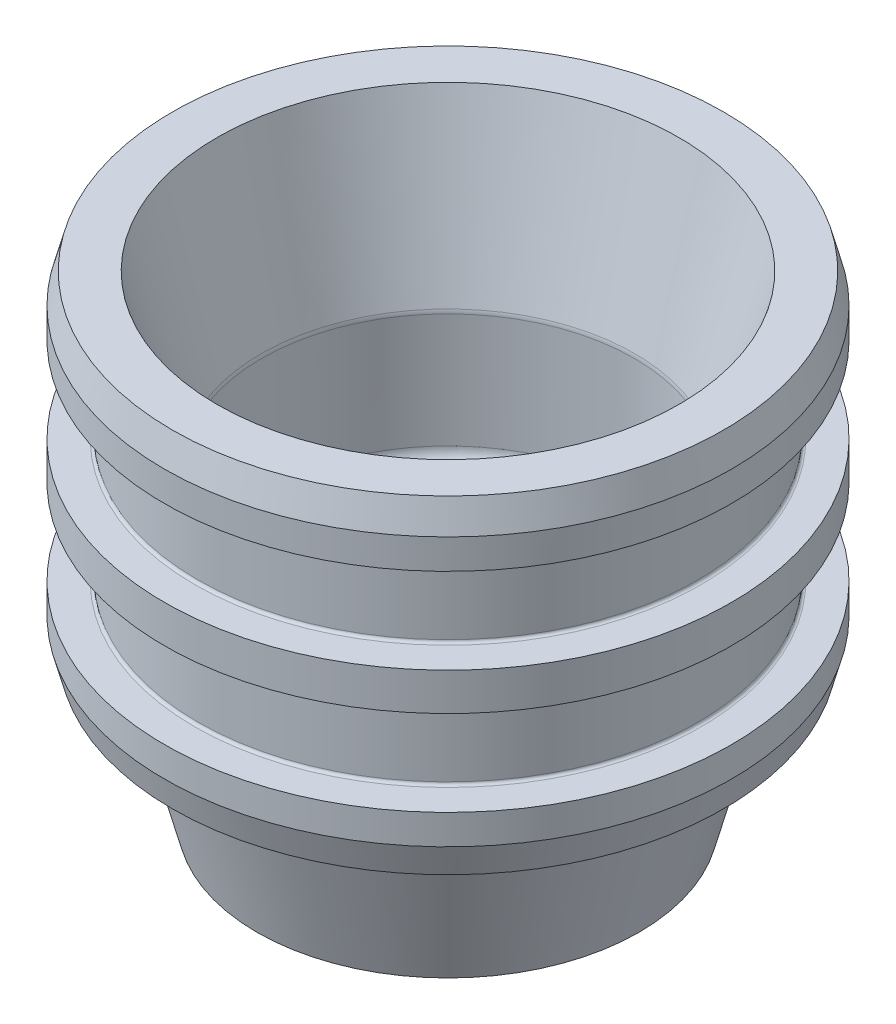
ISO-10303-21;
HEADER;
FILE_DESCRIPTION(('STEP AP214'),'2;1');
FILE_NAME('part.step','',(''),(''),'','','');
FILE_SCHEMA(('AUTOMOTIVE_DESIGN { 1 0 10303 214 1 1 1 1 }'));
ENDSEC;
DATA;
#1=APPLICATION_CONTEXT('core data for automotive mechanical design processes');
#2=APPLICATION_PROTOCOL_DEFINITION('international standard','automotive_design',2000,#1);
#3=PRODUCT_CONTEXT('',#1,'mechanical');
#4=PRODUCT('Part','Part','',(#3));
#5=PRODUCT_RELATED_PRODUCT_CATEGORY('part','',(#4));
#6=PRODUCT_DEFINITION_FORMATION('','',#4);
#7=PRODUCT_DEFINITION_CONTEXT('part definition',#1,'design');
#8=PRODUCT_DEFINITION('design','',#6,#7);
#9=PRODUCT_DEFINITION_SHAPE('','',#8);
#10=(LENGTH_UNIT() NAMED_UNIT(*) SI_UNIT(.MILLI.,.METRE.));
#11=(NAMED_UNIT(*) PLANE_ANGLE_UNIT() SI_UNIT($,.RADIAN.));
#12=(NAMED_UNIT(*) SI_UNIT($,.STERADIAN.) SOLID_ANGLE_UNIT());
#13=UNCERTAINTY_MEASURE_WITH_UNIT(LENGTH_MEASURE(1.E-05),#10,'distance_accuracy_value','');
#14=(GEOMETRIC_REPRESENTATION_CONTEXT(3) GLOBAL_UNCERTAINTY_ASSIGNED_CONTEXT((#13)) GLOBAL_UNIT_ASSIGNED_CONTEXT((#10,
#11,#12)) REPRESENTATION_CONTEXT('',''));
#15=CARTESIAN_POINT('',(0.,0.,0.));
#16=DIRECTION('',(0.,0.,1.));
#17=DIRECTION('',(1.,0.,0.));
#18=AXIS2_PLACEMENT_3D('',#15,#16,#17);
#19=CARTESIAN_POINT('',(0.,40.64,0.));
#20=DIRECTION('',(0.,-1.,0.));
#21=DIRECTION('',(0.,0.,-1.));
#22=AXIS2_PLACEMENT_3D('',#19,#20,#21);
#23=CYLINDRICAL_SURFACE('',#22,24.1554);
#24=CARTESIAN_POINT('',(0.,15.24,0.));
#25=DIRECTION('',(0.,-1.,0.));
#26=DIRECTION('',(0.,0.,-1.));
#27=AXIS2_PLACEMENT_3D('',#24,#25,#26);
#28=CIRCLE('',#27,24.1554);
#29=CARTESIAN_POINT('',(0.,15.24,-24.1554));
#30=VERTEX_POINT('',#29);
#31=EDGE_CURVE('E10',#30,#30,#28,.F.);
#32=ORIENTED_EDGE('',*,*,#31,.T.);
#33=EDGE_LOOP('',(#32));
#34=FACE_BOUND('',#33,.T.);
#35=CARTESIAN_POINT('',(0.,17.78,0.));
#36=DIRECTION('',(0.,-1.,0.));
#37=DIRECTION('',(0.,0.,-1.));
#38=AXIS2_PLACEMENT_3D('',#35,#36,#37);
#39=CIRCLE('',#38,24.1554);
#40=CARTESIAN_POINT('',(0.,17.78,-24.1554));
#41=VERTEX_POINT('',#40);
#42=EDGE_CURVE('E136',#41,#41,#39,.T.);
#43=ORIENTED_EDGE('',*,*,#42,.T.);
#44=EDGE_LOOP('',(#43));
#45=FACE_BOUND('',#44,.T.);
#46=ADVANCED_FACE('F39',(#34,#45),#23,.T.);
#47=CARTESIAN_POINT('',(0.,28.2702,0.));
#48=DIRECTION('',(0.,-1.,0.));
#49=DIRECTION('',(0.,0.,-1.));
#50=AXIS2_PLACEMENT_3D('',#47,#48,#49);
#51=CIRCLE('',#50,24.1554);
#52=CARTESIAN_POINT('',(0.,28.2702,-24.1554));
#53=VERTEX_POINT('',#52);
#54=EDGE_CURVE('E108',#53,#53,#51,.T.);
#55=ORIENTED_EDGE('',*,*,#54,.T.);
#56=EDGE_LOOP('',(#55));
#57=FACE_BOUND('',#56,.T.);
#58=CARTESIAN_POINT('',(0.,25.0698,0.));
#59=DIRECTION('',(0.,-1.,0.));
#60=DIRECTION('',(0.,0.,-1.));
#61=AXIS2_PLACEMENT_3D('',#58,#59,#60);
#62=CIRCLE('',#61,24.1554);
#63=CARTESIAN_POINT('',(0.,25.0698,-24.1554));
#64=VERTEX_POINT('',#63);
#65=EDGE_CURVE('E132',#64,#64,#62,.T.);
#66=ORIENTED_EDGE('',*,*,#65,.F.);
#67=EDGE_LOOP('',(#66));
#68=FACE_BOUND('',#67,.T.);
#69=ADVANCED_FACE('F174',(#57,#68),#23,.T.);
#70=CARTESIAN_POINT('',(0.,38.0999999999999,0.));
#71=DIRECTION('',(0.,1.,0.));
#72=DIRECTION('',(0.,0.,1.));
#73=AXIS2_PLACEMENT_3D('',#70,#71,#72);
#74=CIRCLE('',#73,24.1554);
#75=CARTESIAN_POINT('',(0.,38.0999999999999,24.1554));
#76=VERTEX_POINT('',#75);
#77=EDGE_CURVE('E84',#76,#76,#74,.F.);
#78=ORIENTED_EDGE('',*,*,#77,.T.);
#79=EDGE_LOOP('',(#78));
#80=FACE_BOUND('',#79,.T.);
#81=CARTESIAN_POINT('',(0.,35.56,0.));
#82=DIRECTION('',(0.,-1.,0.));
#83=DIRECTION('',(0.,0.,-1.));
#84=AXIS2_PLACEMENT_3D('',#81,#82,#83);
#85=CIRCLE('',#84,24.1554);
#86=CARTESIAN_POINT('',(0.,35.56,-24.1554));
#87=VERTEX_POINT('',#86);
#88=EDGE_CURVE('E112',#87,#87,#85,.T.);
#89=ORIENTED_EDGE('',*,*,#88,.F.);
#90=EDGE_LOOP('',(#89));
#91=FACE_BOUND('',#90,.T.);
#92=ADVANCED_FACE('F176',(#80,#91),#23,.T.);
#93=CARTESIAN_POINT('',(0.,40.64,0.));
#94=DIRECTION('',(0.,1.,0.));
#95=DIRECTION('',(0.,0.,1.));
#96=AXIS2_PLACEMENT_3D('',#93,#94,#95);
#97=PLANE('',#96);
#98=CARTESIAN_POINT('',(0.,40.64,0.));
#99=DIRECTION('',(0.,1.,0.));
#100=DIRECTION('',(0.,0.,1.));
#101=AXIS2_PLACEMENT_3D('',#98,#99,#100);
#102=CIRCLE('',#101,19.685);
#103=CARTESIAN_POINT('',(0.,40.64,19.685));
#104=VERTEX_POINT('',#103);
#105=EDGE_CURVE('E80',#104,#104,#102,.F.);
#106=ORIENTED_EDGE('',*,*,#105,.T.);
#107=EDGE_LOOP('',(#106));
#108=FACE_BOUND('',#107,.T.);
#109=CARTESIAN_POINT('',(0.,40.64,0.));
#110=DIRECTION('',(0.,1.,0.));
#111=DIRECTION('',(0.,0.,1.));
#112=AXIS2_PLACEMENT_3D('',#109,#110,#111);
#113=CIRCLE('',#112,23.4748090512249);
#114=CARTESIAN_POINT('',(0.,40.64,23.4748090512249));
#115=VERTEX_POINT('',#114);
#116=EDGE_CURVE('E88',#115,#115,#113,.T.);
#117=ORIENTED_EDGE('',*,*,#116,.T.);
#118=EDGE_LOOP('',(#117));
#119=FACE_BOUND('',#118,.T.);
#120=ADVANCED_FACE('F183',(#108,#119),#97,.T.);
#121=CARTESIAN_POINT('',(0.,15.24,0.));
#122=DIRECTION('',(0.,1.,0.));
#123=DIRECTION('',(0.,0.,1.));
#124=AXIS2_PLACEMENT_3D('',#121,#122,#123);
#125=CYLINDRICAL_SURFACE('',#124,15.875);
#126=CARTESIAN_POINT('',(0.,26.2536877512266,0.));
#127=DIRECTION('',(0.,-1.,0.));
#128=DIRECTION('',(0.,0.,-1.));
#129=AXIS2_PLACEMENT_3D('',#126,#127,#128);
#130=CIRCLE('',#129,15.875);
#131=CARTESIAN_POINT('',(0.,26.2536877512266,-15.875));
#132=VERTEX_POINT('',#131);
#133=EDGE_CURVE('E64',#132,#132,#130,.F.);
#134=ORIENTED_EDGE('',*,*,#133,.T.);
#135=EDGE_LOOP('',(#134));
#136=FACE_BOUND('',#135,.T.);
#137=CARTESIAN_POINT('',(0.,16.51,0.));
#138=DIRECTION('',(0.,1.,0.));
#139=DIRECTION('',(0.,0.,1.));
#140=AXIS2_PLACEMENT_3D('',#137,#138,#139);
#141=CIRCLE('',#140,15.875);
#142=CARTESIAN_POINT('',(0.,16.51,15.875));
#143=VERTEX_POINT('',#142);
#144=EDGE_CURVE('E68',#143,#143,#141,.F.);
#145=ORIENTED_EDGE('',*,*,#144,.T.);
#146=EDGE_LOOP('',(#145));
#147=FACE_BOUND('',#146,.T.);
#148=ADVANCED_FACE('F227',(#136,#147),#125,.F.);
#149=CARTESIAN_POINT('',(0.,15.24,0.));
#150=DIRECTION('',(0.,1.,0.));
#151=DIRECTION('',(0.,0.,1.));
#152=AXIS2_PLACEMENT_3D('',#149,#150,#151);
#153=PLANE('',#152);
#154=CARTESIAN_POINT('',(0.,15.24,0.));
#155=DIRECTION('',(0.,1.,0.));
#156=DIRECTION('',(0.,0.,1.));
#157=AXIS2_PLACEMENT_3D('',#154,#155,#156);
#158=CIRCLE('',#157,14.605);
#159=CARTESIAN_POINT('',(0.,15.24,14.605));
#160=VERTEX_POINT('',#159);
#161=EDGE_CURVE('E53',#160,#160,#158,.T.);
#162=ORIENTED_EDGE('',*,*,#161,.T.);
#163=EDGE_LOOP('',(#162));
#164=FACE_BOUND('',#163,.T.);
#165=ADVANCED_FACE('F224',(#164),#153,.T.);
#166=CARTESIAN_POINT('',(-24.1554,35.56,0.));
#167=DIRECTION('',(0.,-1.,0.));
#168=DIRECTION('',(0.,0.,-1.));
#169=AXIS2_PLACEMENT_3D('',#166,#167,#168);
#170=PLANE('',#169);
#171=ORIENTED_EDGE('',*,*,#88,.T.);
#172=EDGE_LOOP('',(#171));
#173=FACE_BOUND('',#172,.T.);
#174=CARTESIAN_POINT('',(0.,35.56,0.));
#175=DIRECTION('',(0.,-1.,0.));
#176=DIRECTION('',(0.,0.,-1.));
#177=AXIS2_PLACEMENT_3D('',#174,#175,#176);
#178=CIRCLE('',#177,21.5508123847554);
#179=CARTESIAN_POINT('',(0.,35.56,-21.5508123847554));
#180=VERTEX_POINT('',#179);
#181=EDGE_CURVE('E92',#180,#180,#178,.T.);
#182=ORIENTED_EDGE('',*,*,#181,.F.);
#183=EDGE_LOOP('',(#182));
#184=FACE_BOUND('',#183,.T.);
#185=ADVANCED_FACE('F226',(#173,#184),#170,.T.);
#186=CARTESIAN_POINT('',(0.,35.3197876152446,0.));
#187=DIRECTION('',(0.,-1.,0.));
#188=DIRECTION('',(0.,0.,-1.));
#189=AXIS2_PLACEMENT_3D('',#186,#187,#188);
#190=TOROIDAL_SURFACE('',#189,21.5508123847554,0.240212384755432);
#191=ORIENTED_EDGE('',*,*,#181,.T.);
#192=EDGE_LOOP('',(#191));
#193=FACE_BOUND('',#192,.T.);
#194=CARTESIAN_POINT('',(0.,35.3197876152446,0.));
#195=DIRECTION('',(0.,-1.,0.));
#196=DIRECTION('',(0.,0.,-1.));
#197=AXIS2_PLACEMENT_3D('',#194,#195,#196);
#198=CIRCLE('',#197,21.3106);
#199=CARTESIAN_POINT('',(0.,35.3197876152446,-21.3106));
#200=VERTEX_POINT('',#199);
#201=EDGE_CURVE('E96',#200,#200,#198,.T.);
#202=ORIENTED_EDGE('',*,*,#201,.F.);
#203=EDGE_LOOP('',(#202));
#204=FACE_BOUND('',#203,.T.);
#205=ADVANCED_FACE('F233',(#193,#204),#190,.F.);
#206=CARTESIAN_POINT('',(0.,0.,0.));
#207=DIRECTION('',(0.,-1.,0.));
#208=DIRECTION('',(0.,0.,-1.));
#209=AXIS2_PLACEMENT_3D('',#206,#207,#208);
#210=CYLINDRICAL_SURFACE('',#209,21.3106);
#211=ORIENTED_EDGE('',*,*,#201,.T.);
#212=EDGE_LOOP('',(#211));
#213=FACE_BOUND('',#212,.T.);
#214=CARTESIAN_POINT('',(0.,28.5104123847554,0.));
#215=DIRECTION('',(0.,-1.,0.));
#216=DIRECTION('',(0.,0.,-1.));
#217=AXIS2_PLACEMENT_3D('',#214,#215,#216);
#218=CIRCLE('',#217,21.3106);
#219=CARTESIAN_POINT('',(0.,28.5104123847554,-21.3106));
#220=VERTEX_POINT('',#219);
#221=EDGE_CURVE('E100',#220,#220,#218,.T.);
#222=ORIENTED_EDGE('',*,*,#221,.F.);
#223=EDGE_LOOP('',(#222));
#224=FACE_BOUND('',#223,.T.);
#225=ADVANCED_FACE('F359',(#213,#224),#210,.T.);
#226=CARTESIAN_POINT('',(0.,28.5104123847554,0.));
#227=DIRECTION('',(0.,-1.,0.));
#228=DIRECTION('',(0.,0.,-1.));
#229=AXIS2_PLACEMENT_3D('',#226,#227,#228);
#230=TOROIDAL_SURFACE('',#229,21.5508123847554,0.240212384755436);
#231=ORIENTED_EDGE('',*,*,#221,.T.);
#232=EDGE_LOOP('',(#231));
#233=FACE_BOUND('',#232,.T.);
#234=CARTESIAN_POINT('',(0.,28.2702,0.));
#235=DIRECTION('',(0.,-1.,0.));
#236=DIRECTION('',(0.,0.,-1.));
#237=AXIS2_PLACEMENT_3D('',#234,#235,#236);
#238=CIRCLE('',#237,21.5508123847554);
#239=CARTESIAN_POINT('',(0.,28.2702,-21.5508123847554));
#240=VERTEX_POINT('',#239);
#241=EDGE_CURVE('E104',#240,#240,#238,.T.);
#242=ORIENTED_EDGE('',*,*,#241,.F.);
#243=EDGE_LOOP('',(#242));
#244=FACE_BOUND('',#243,.T.);
#245=ADVANCED_FACE('F355',(#233,#244),#230,.F.);
#246=CARTESIAN_POINT('',(-21.5508123847554,28.2702,0.));
#247=DIRECTION('',(0.,1.,0.));
#248=DIRECTION('',(0.,0.,1.));
#249=AXIS2_PLACEMENT_3D('',#246,#247,#248);
#250=PLANE('',#249);
#251=ORIENTED_EDGE('',*,*,#241,.T.);
#252=EDGE_LOOP('',(#251));
#253=FACE_BOUND('',#252,.T.);
#254=ORIENTED_EDGE('',*,*,#54,.F.);
#255=EDGE_LOOP('',(#254));
#256=FACE_BOUND('',#255,.T.);
#257=ADVANCED_FACE('F196',(#253,#256),#250,.T.);
#258=CARTESIAN_POINT('',(0.,40.64,0.));
#259=DIRECTION('',(0.,-1.,0.));
#260=DIRECTION('',(0.,0.,-1.));
#261=AXIS2_PLACEMENT_3D('',#258,#259,#260);
#262=CONICAL_SURFACE('',#261,23.4748090512249,0.261799387799145);
#263=ORIENTED_EDGE('',*,*,#77,.F.);
#264=EDGE_LOOP('',(#263));
#265=FACE_BOUND('',#264,.T.);
#266=ORIENTED_EDGE('',*,*,#116,.F.);
#267=EDGE_LOOP('',(#266));
#268=FACE_BOUND('',#267,.T.);
#269=ADVANCED_FACE('F190',(#265,#268),#262,.T.);
#270=CARTESIAN_POINT('',(0.,26.4208864231626,0.));
#271=DIRECTION('',(0.,1.,0.));
#272=DIRECTION('',(0.,0.,1.));
#273=AXIS2_PLACEMENT_3D('',#270,#271,#272);
#274=CONICAL_SURFACE('',#273,15.875,0.26179938779915);
#275=CARTESIAN_POINT('',(0.,26.5823879385068,0.));
#276=DIRECTION('',(0.,1.,0.));
#277=DIRECTION('',(0.,0.,1.));
#278=AXIS2_PLACEMENT_3D('',#275,#276,#277);
#279=CIRCLE('',#278,15.9182742006129);
#280=CARTESIAN_POINT('',(0.,26.5823879385068,15.9182742006129));
#281=VERTEX_POINT('',#280);
#282=EDGE_CURVE('E58',#281,#281,#279,.F.);
#283=ORIENTED_EDGE('',*,*,#282,.T.);
#284=EDGE_LOOP('',(#283));
#285=FACE_BOUND('',#284,.T.);
#286=ORIENTED_EDGE('',*,*,#105,.F.);
#287=EDGE_LOOP('',(#286));
#288=FACE_BOUND('',#287,.T.);
#289=ADVANCED_FACE('F146',(#285,#288),#274,.F.);
#290=CARTESIAN_POINT('',(-24.1554,17.78,0.));
#291=DIRECTION('',(0.,1.,0.));
#292=DIRECTION('',(0.,0.,-1.));
#293=AXIS2_PLACEMENT_3D('',#290,#291,#292);
#294=PLANE('',#293);
#295=ORIENTED_EDGE('',*,*,#42,.F.);
#296=EDGE_LOOP('',(#295));
#297=FACE_BOUND('',#296,.T.);
#298=CARTESIAN_POINT('',(0.,17.78,0.));
#299=DIRECTION('',(0.,-1.,0.));
#300=DIRECTION('',(0.,0.,-1.));
#301=AXIS2_PLACEMENT_3D('',#298,#299,#300);
#302=CIRCLE('',#301,21.5508123847554);
#303=CARTESIAN_POINT('',(0.,17.78,-21.5508123847554));
#304=VERTEX_POINT('',#303);
#305=EDGE_CURVE('E116',#304,#304,#302,.T.);
#306=ORIENTED_EDGE('',*,*,#305,.T.);
#307=EDGE_LOOP('',(#306));
#308=FACE_BOUND('',#307,.T.);
#309=ADVANCED_FACE('F142',(#297,#308),#294,.T.);
#310=CARTESIAN_POINT('',(0.,18.0202123847554,0.));
#311=DIRECTION('',(0.,1.,0.));
#312=DIRECTION('',(0.,0.,-1.));
#313=AXIS2_PLACEMENT_3D('',#310,#311,#312);
#314=TOROIDAL_SURFACE('',#313,21.5508123847554,0.240212384755432);
#315=ORIENTED_EDGE('',*,*,#305,.F.);
#316=EDGE_LOOP('',(#315));
#317=FACE_BOUND('',#316,.T.);
#318=CARTESIAN_POINT('',(0.,18.0202123847554,0.));
#319=DIRECTION('',(0.,-1.,0.));
#320=DIRECTION('',(0.,0.,-1.));
#321=AXIS2_PLACEMENT_3D('',#318,#319,#320);
#322=CIRCLE('',#321,21.3106);
#323=CARTESIAN_POINT('',(0.,18.0202123847554,-21.3106));
#324=VERTEX_POINT('',#323);
#325=EDGE_CURVE('E120',#324,#324,#322,.T.);
#326=ORIENTED_EDGE('',*,*,#325,.T.);
#327=EDGE_LOOP('',(#326));
#328=FACE_BOUND('',#327,.T.);
#329=ADVANCED_FACE('F145',(#317,#328),#314,.F.);
#330=CARTESIAN_POINT('',(0.,53.34,0.));
#331=DIRECTION('',(0.,1.,0.));
#332=DIRECTION('',(0.,0.,-1.));
#333=AXIS2_PLACEMENT_3D('',#330,#331,#332);
#334=CYLINDRICAL_SURFACE('',#333,21.3106);
#335=ORIENTED_EDGE('',*,*,#325,.F.);
#336=EDGE_LOOP('',(#335));
#337=FACE_BOUND('',#336,.T.);
#338=CARTESIAN_POINT('',(0.,24.8295876152446,0.));
#339=DIRECTION('',(0.,-1.,0.));
#340=DIRECTION('',(0.,0.,-1.));
#341=AXIS2_PLACEMENT_3D('',#338,#339,#340);
#342=CIRCLE('',#341,21.3106);
#343=CARTESIAN_POINT('',(0.,24.8295876152446,-21.3106));
#344=VERTEX_POINT('',#343);
#345=EDGE_CURVE('E124',#344,#344,#342,.T.);
#346=ORIENTED_EDGE('',*,*,#345,.T.);
#347=EDGE_LOOP('',(#346));
#348=FACE_BOUND('',#347,.T.);
#349=ADVANCED_FACE('F152',(#337,#348),#334,.T.);
#350=CARTESIAN_POINT('',(0.,24.8295876152446,0.));
#351=DIRECTION('',(0.,1.,0.));
#352=DIRECTION('',(0.,0.,-1.));
#353=AXIS2_PLACEMENT_3D('',#350,#351,#352);
#354=TOROIDAL_SURFACE('',#353,21.5508123847554,0.240212384755436);
#355=ORIENTED_EDGE('',*,*,#345,.F.);
#356=EDGE_LOOP('',(#355));
#357=FACE_BOUND('',#356,.T.);
#358=CARTESIAN_POINT('',(0.,25.0698,0.));
#359=DIRECTION('',(0.,-1.,0.));
#360=DIRECTION('',(0.,0.,-1.));
#361=AXIS2_PLACEMENT_3D('',#358,#359,#360);
#362=CIRCLE('',#361,21.5508123847554);
#363=CARTESIAN_POINT('',(0.,25.0698,-21.5508123847554));
#364=VERTEX_POINT('',#363);
#365=EDGE_CURVE('E128',#364,#364,#362,.T.);
#366=ORIENTED_EDGE('',*,*,#365,.T.);
#367=EDGE_LOOP('',(#366));
#368=FACE_BOUND('',#367,.T.);
#369=ADVANCED_FACE('F158',(#357,#368),#354,.F.);
#370=CARTESIAN_POINT('',(-21.5508123847554,25.0698,0.));
#371=DIRECTION('',(0.,-1.,0.));
#372=DIRECTION('',(0.,0.,1.));
#373=AXIS2_PLACEMENT_3D('',#370,#371,#372);
#374=PLANE('',#373);
#375=ORIENTED_EDGE('',*,*,#365,.F.);
#376=EDGE_LOOP('',(#375));
#377=FACE_BOUND('',#376,.T.);
#378=ORIENTED_EDGE('',*,*,#65,.T.);
#379=EDGE_LOOP('',(#378));
#380=FACE_BOUND('',#379,.T.);
#381=ADVANCED_FACE('F164',(#377,#380),#374,.T.);
#382=CARTESIAN_POINT('',(0.,12.7,0.));
#383=DIRECTION('',(0.,-1.,0.));
#384=DIRECTION('',(0.,0.,-1.));
#385=AXIS2_PLACEMENT_3D('',#382,#383,#384);
#386=PLANE('',#385);
#387=CARTESIAN_POINT('',(0.,12.7,0.));
#388=DIRECTION('',(0.,-1.,0.));
#389=DIRECTION('',(0.,0.,-1.));
#390=AXIS2_PLACEMENT_3D('',#387,#388,#389);
#391=CIRCLE('',#390,23.474809051225);
#392=CARTESIAN_POINT('',(0.,12.7,-23.474809051225));
#393=VERTEX_POINT('',#392);
#394=EDGE_CURVE('E48',#393,#393,#391,.T.);
#395=ORIENTED_EDGE('',*,*,#394,.T.);
#396=EDGE_LOOP('',(#395));
#397=FACE_BOUND('',#396,.T.);
#398=CARTESIAN_POINT('',(0.,12.7,0.));
#399=DIRECTION('',(0.,-1.,0.));
#400=DIRECTION('',(0.,0.,-1.));
#401=AXIS2_PLACEMENT_3D('',#398,#399,#400);
#402=CIRCLE('',#401,19.6850000000001);
#403=CARTESIAN_POINT('',(0.,12.7,-19.6850000000001));
#404=VERTEX_POINT('',#403);
#405=EDGE_CURVE('E76',#404,#404,#402,.F.);
#406=ORIENTED_EDGE('',*,*,#405,.T.);
#407=EDGE_LOOP('',(#406));
#408=FACE_BOUND('',#407,.T.);
#409=ADVANCED_FACE('F170',(#397,#408),#386,.T.);
#410=CARTESIAN_POINT('',(0.,0.,0.));
#411=DIRECTION('',(0.,1.,0.));
#412=DIRECTION('',(0.,0.,1.));
#413=AXIS2_PLACEMENT_3D('',#410,#411,#412);
#414=PLANE('',#413);
#415=CARTESIAN_POINT('',(0.,0.,0.));
#416=DIRECTION('',(0.,1.,0.));
#417=DIRECTION('',(0.,0.,1.));
#418=AXIS2_PLACEMENT_3D('',#415,#416,#417);
#419=CIRCLE('',#418,16.2820452561249);
#420=CARTESIAN_POINT('',(0.,0.,16.2820452561249));
#421=VERTEX_POINT('',#420);
#422=EDGE_CURVE('E72',#421,#421,#419,.F.);
#423=ORIENTED_EDGE('',*,*,#422,.T.);
#424=EDGE_LOOP('',(#423));
#425=FACE_BOUND('',#424,.T.);
#426=ADVANCED_FACE('F187',(#425),#414,.F.);
#427=CARTESIAN_POINT('',(0.,-1.51911357683799,0.));
#428=DIRECTION('',(0.,1.,0.));
#429=DIRECTION('',(0.,0.,1.));
#430=AXIS2_PLACEMENT_3D('',#427,#428,#429);
#431=CONICAL_SURFACE('',#430,15.875,0.261799387799146);
#432=ORIENTED_EDGE('',*,*,#405,.F.);
#433=EDGE_LOOP('',(#432));
#434=FACE_BOUND('',#433,.T.);
#435=ORIENTED_EDGE('',*,*,#422,.F.);
#436=EDGE_LOOP('',(#435));
#437=FACE_BOUND('',#436,.T.);
#438=ADVANCED_FACE('F204',(#434,#437),#431,.T.);
#439=CARTESIAN_POINT('',(0.,26.2536877512266,0.));
#440=DIRECTION('',(0.,-1.,0.));
#441=DIRECTION('',(0.,0.,-1.));
#442=AXIS2_PLACEMENT_3D('',#439,#440,#441);
#443=TOROIDAL_SURFACE('',#442,17.145,1.27);
#444=ORIENTED_EDGE('',*,*,#282,.F.);
#445=EDGE_LOOP('',(#444));
#446=FACE_BOUND('',#445,.T.);
#447=ORIENTED_EDGE('',*,*,#133,.F.);
#448=EDGE_LOOP('',(#447));
#449=FACE_BOUND('',#448,.T.);
#450=ADVANCED_FACE('F209',(#446,#449),#443,.T.);
#451=CARTESIAN_POINT('',(0.,16.51,0.));
#452=DIRECTION('',(0.,1.,0.));
#453=DIRECTION('',(0.,0.,1.));
#454=AXIS2_PLACEMENT_3D('',#451,#452,#453);
#455=TOROIDAL_SURFACE('',#454,14.605,1.27);
#456=ORIENTED_EDGE('',*,*,#144,.F.);
#457=EDGE_LOOP('',(#456));
#458=FACE_BOUND('',#457,.T.);
#459=ORIENTED_EDGE('',*,*,#161,.F.);
#460=EDGE_LOOP('',(#459));
#461=FACE_BOUND('',#460,.T.);
#462=ADVANCED_FACE('F212',(#458,#461),#455,.F.);
#463=CARTESIAN_POINT('',(0.,12.7,0.));
#464=DIRECTION('',(0.,1.,0.));
#465=DIRECTION('',(0.,0.,1.));
#466=AXIS2_PLACEMENT_3D('',#463,#464,#465);
#467=CONICAL_SURFACE('',#466,23.474809051225,0.261799387799146);
#468=ORIENTED_EDGE('',*,*,#31,.F.);
#469=EDGE_LOOP('',(#468));
#470=FACE_BOUND('',#469,.T.);
#471=ORIENTED_EDGE('',*,*,#394,.F.);
#472=EDGE_LOOP('',(#471));
#473=FACE_BOUND('',#472,.T.);
#474=ADVANCED_FACE('F42',(#470,#473),#467,.T.);
#475=CLOSED_SHELL('',(#46,#69,#92,#120,#148,#165,#185,#205,#225,#245,#257,#269,#289,#309,#329,
#349,#369,#381,#409,#426,#438,#450,#462,#474));
#476=MANIFOLD_SOLID_BREP('B2',#475);
#477=ADVANCED_BREP_SHAPE_REPRESENTATION('',(#18,#476),#14);
#478=SHAPE_DEFINITION_REPRESENTATION(#9,#477);
ENDSEC;
END-ISO-10303-21;
